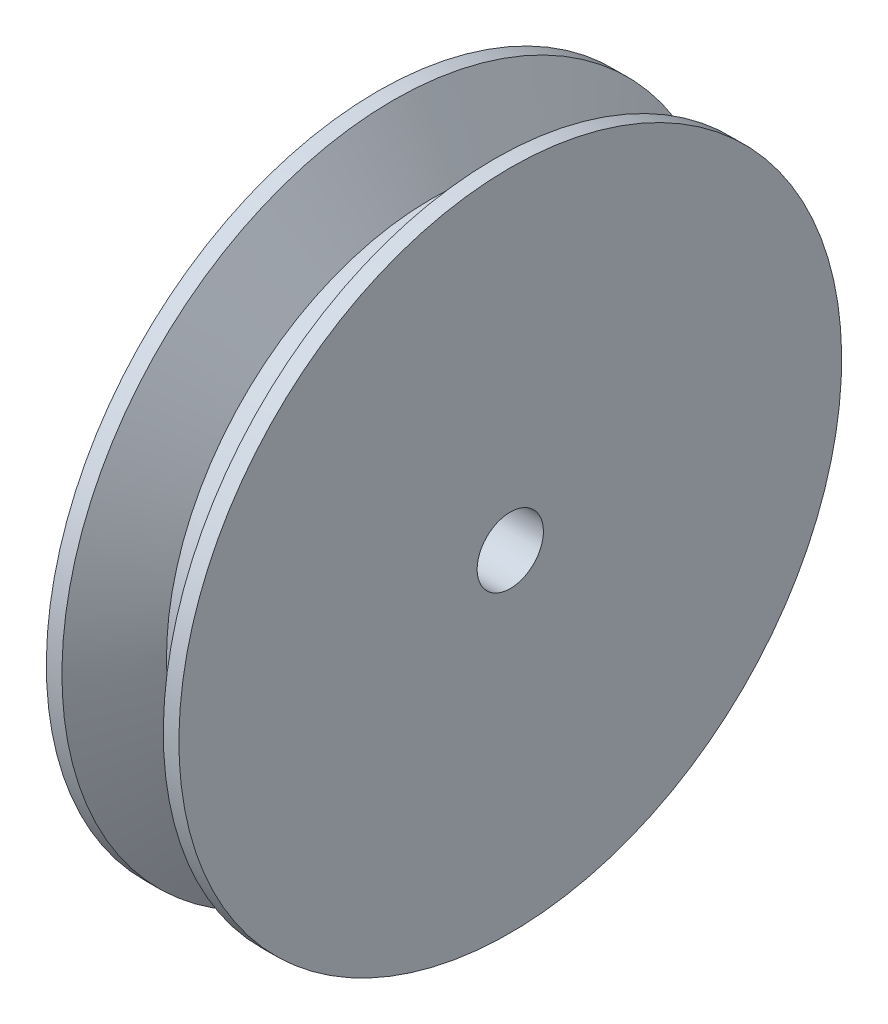
ISO-10303-21;
HEADER;
FILE_DESCRIPTION(('STEP AP214'),'2;1');
FILE_NAME('part.step','',(''),(''),'','','');
FILE_SCHEMA(('AUTOMOTIVE_DESIGN { 1 0 10303 214 1 1 1 1 }'));
ENDSEC;
DATA;
#1=APPLICATION_CONTEXT('core data for automotive mechanical design processes');
#2=APPLICATION_PROTOCOL_DEFINITION('international standard','automotive_design',2000,#1);
#3=PRODUCT_CONTEXT('',#1,'mechanical');
#4=PRODUCT('Part','Part','',(#3));
#5=PRODUCT_RELATED_PRODUCT_CATEGORY('part','',(#4));
#6=PRODUCT_DEFINITION_FORMATION('','',#4);
#7=PRODUCT_DEFINITION_CONTEXT('part definition',#1,'design');
#8=PRODUCT_DEFINITION('design','',#6,#7);
#9=PRODUCT_DEFINITION_SHAPE('','',#8);
#10=(LENGTH_UNIT() NAMED_UNIT(*) SI_UNIT(.MILLI.,.METRE.));
#11=(NAMED_UNIT(*) PLANE_ANGLE_UNIT() SI_UNIT($,.RADIAN.));
#12=(NAMED_UNIT(*) SI_UNIT($,.STERADIAN.) SOLID_ANGLE_UNIT());
#13=UNCERTAINTY_MEASURE_WITH_UNIT(LENGTH_MEASURE(1.E-05),#10,'distance_accuracy_value','');
#14=(GEOMETRIC_REPRESENTATION_CONTEXT(3) GLOBAL_UNCERTAINTY_ASSIGNED_CONTEXT((#13)) GLOBAL_UNIT_ASSIGNED_CONTEXT((#10,
#11,#12)) REPRESENTATION_CONTEXT('',''));
#15=CARTESIAN_POINT('',(0.,0.,0.));
#16=DIRECTION('',(0.,0.,1.));
#17=DIRECTION('',(1.,0.,0.));
#18=AXIS2_PLACEMENT_3D('',#15,#16,#17);
#19=CARTESIAN_POINT('',(4.,0.,0.));
#20=DIRECTION('',(1.,0.,0.));
#21=DIRECTION('',(0.,1.,0.));
#22=AXIS2_PLACEMENT_3D('',#19,#20,#21);
#23=CYLINDRICAL_SURFACE('',#22,20.);
#24=CARTESIAN_POINT('',(-4.00000000000002,0.,0.));
#25=DIRECTION('',(1.,0.,0.));
#26=DIRECTION('',(0.,1.,0.));
#27=AXIS2_PLACEMENT_3D('',#24,#25,#26);
#28=CIRCLE('',#27,20.);
#29=CARTESIAN_POINT('',(-4.,20.,0.));
#30=VERTEX_POINT('',#29);
#31=EDGE_CURVE('E143',#30,#30,#28,.T.);
#32=ORIENTED_EDGE('',*,*,#31,.T.);
#33=EDGE_LOOP('',(#32));
#34=FACE_BOUND('',#33,.T.);
#35=CARTESIAN_POINT('',(-3.05940107675853,0.,0.));
#36=DIRECTION('',(1.,0.,0.));
#37=DIRECTION('',(0.,1.,0.));
#38=AXIS2_PLACEMENT_3D('',#35,#36,#37);
#39=CIRCLE('',#38,20.);
#40=CARTESIAN_POINT('',(-3.05940107675851,20.,0.));
#41=VERTEX_POINT('',#40);
#42=EDGE_CURVE('E167',#41,#41,#39,.T.);
#43=ORIENTED_EDGE('',*,*,#42,.F.);
#44=EDGE_LOOP('',(#43));
#45=FACE_BOUND('',#44,.T.);
#46=ADVANCED_FACE('F41',(#34,#45),#23,.T.);
#47=CARTESIAN_POINT('',(-4.00000000000001,0.,0.));
#48=DIRECTION('',(-1.,0.,0.));
#49=DIRECTION('',(0.,-1.,0.));
#50=AXIS2_PLACEMENT_3D('',#47,#48,#49);
#51=PLANE('',#50);
#52=CARTESIAN_POINT('',(-4.00000000000001,0.,0.));
#53=DIRECTION('',(-1.,0.,0.));
#54=DIRECTION('',(0.,-1.,0.));
#55=AXIS2_PLACEMENT_3D('',#52,#53,#54);
#56=CIRCLE('',#55,5.5);
#57=CARTESIAN_POINT('',(-4.00000000000002,-5.5,0.));
#58=VERTEX_POINT('',#57);
#59=EDGE_CURVE('E10',#58,#58,#56,.F.);
#60=ORIENTED_EDGE('',*,*,#59,.T.);
#61=EDGE_LOOP('',(#60));
#62=FACE_BOUND('',#61,.T.);
#63=ORIENTED_EDGE('',*,*,#31,.F.);
#64=EDGE_LOOP('',(#63));
#65=FACE_BOUND('',#64,.T.);
#66=ADVANCED_FACE('F121',(#62,#65),#51,.T.);
#67=CARTESIAN_POINT('',(3.99999999999999,0.,0.));
#68=DIRECTION('',(1.,0.,0.));
#69=DIRECTION('',(0.,1.,0.));
#70=AXIS2_PLACEMENT_3D('',#67,#68,#69);
#71=PLANE('',#70);
#72=CARTESIAN_POINT('',(4.00000000000002,0.,0.));
#73=DIRECTION('',(-1.,0.,0.));
#74=DIRECTION('',(0.,-1.,0.));
#75=AXIS2_PLACEMENT_3D('',#72,#73,#74);
#76=CIRCLE('',#75,2.);
#77=CARTESIAN_POINT('',(4.00000000000002,-2.,0.));
#78=VERTEX_POINT('',#77);
#79=EDGE_CURVE('E171',#78,#78,#76,.T.);
#80=ORIENTED_EDGE('',*,*,#79,.T.);
#81=EDGE_LOOP('',(#80));
#82=FACE_BOUND('',#81,.T.);
#83=CARTESIAN_POINT('',(3.99999999999998,0.,0.));
#84=DIRECTION('',(1.,0.,0.));
#85=DIRECTION('',(0.,1.,0.));
#86=AXIS2_PLACEMENT_3D('',#83,#84,#85);
#87=CIRCLE('',#86,20.);
#88=CARTESIAN_POINT('',(4.,20.,0.));
#89=VERTEX_POINT('',#88);
#90=EDGE_CURVE('E149',#89,#89,#87,.T.);
#91=ORIENTED_EDGE('',*,*,#90,.T.);
#92=EDGE_LOOP('',(#91));
#93=FACE_BOUND('',#92,.T.);
#94=ADVANCED_FACE('F117',(#82,#93),#71,.T.);
#95=CARTESIAN_POINT('',(4.,0.,0.));
#96=DIRECTION('',(1.,0.,0.));
#97=DIRECTION('',(0.,1.,0.));
#98=AXIS2_PLACEMENT_3D('',#95,#96,#97);
#99=CYLINDRICAL_SURFACE('',#98,20.);
#100=CARTESIAN_POINT('',(3.05940107675849,0.,0.));
#101=DIRECTION('',(1.,0.,0.));
#102=DIRECTION('',(0.,1.,0.));
#103=AXIS2_PLACEMENT_3D('',#100,#101,#102);
#104=CIRCLE('',#103,20.);
#105=CARTESIAN_POINT('',(3.05940107675851,20.,0.));
#106=VERTEX_POINT('',#105);
#107=EDGE_CURVE('E155',#106,#106,#104,.T.);
#108=ORIENTED_EDGE('',*,*,#107,.T.);
#109=EDGE_LOOP('',(#108));
#110=FACE_BOUND('',#109,.T.);
#111=ORIENTED_EDGE('',*,*,#90,.F.);
#112=EDGE_LOOP('',(#111));
#113=FACE_BOUND('',#112,.T.);
#114=ADVANCED_FACE('F113',(#110,#113),#99,.T.);
#115=CARTESIAN_POINT('',(3.05940107675849,0.,0.));
#116=DIRECTION('',(1.,0.,0.));
#117=DIRECTION('',(0.,1.,0.));
#118=AXIS2_PLACEMENT_3D('',#115,#116,#117);
#119=CONICAL_SURFACE('',#118,20.,1.0471975511966);
#120=CARTESIAN_POINT('',(0.749999999999983,0.,0.));
#121=DIRECTION('',(1.,0.,0.));
#122=DIRECTION('',(0.,1.,0.));
#123=AXIS2_PLACEMENT_3D('',#120,#121,#122);
#124=CIRCLE('',#123,16.);
#125=CARTESIAN_POINT('',(0.75,16.,0.));
#126=VERTEX_POINT('',#125);
#127=EDGE_CURVE('E159',#126,#126,#124,.T.);
#128=ORIENTED_EDGE('',*,*,#127,.T.);
#129=EDGE_LOOP('',(#128));
#130=FACE_BOUND('',#129,.T.);
#131=ORIENTED_EDGE('',*,*,#107,.F.);
#132=EDGE_LOOP('',(#131));
#133=FACE_BOUND('',#132,.T.);
#134=ADVANCED_FACE('F109',(#130,#133),#119,.T.);
#135=CARTESIAN_POINT('',(4.,0.,0.));
#136=DIRECTION('',(1.,0.,0.));
#137=DIRECTION('',(0.,1.,0.));
#138=AXIS2_PLACEMENT_3D('',#135,#136,#137);
#139=CYLINDRICAL_SURFACE('',#138,16.);
#140=CARTESIAN_POINT('',(-0.750000000000016,0.,0.));
#141=DIRECTION('',(1.,0.,0.));
#142=DIRECTION('',(0.,1.,0.));
#143=AXIS2_PLACEMENT_3D('',#140,#141,#142);
#144=CIRCLE('',#143,16.);
#145=CARTESIAN_POINT('',(-0.75,16.,0.));
#146=VERTEX_POINT('',#145);
#147=EDGE_CURVE('E163',#146,#146,#144,.T.);
#148=ORIENTED_EDGE('',*,*,#147,.T.);
#149=EDGE_LOOP('',(#148));
#150=FACE_BOUND('',#149,.T.);
#151=ORIENTED_EDGE('',*,*,#127,.F.);
#152=EDGE_LOOP('',(#151));
#153=FACE_BOUND('',#152,.T.);
#154=ADVANCED_FACE('F105',(#150,#153),#139,.T.);
#155=CARTESIAN_POINT('',(-0.750000000000016,0.,0.));
#156=DIRECTION('',(-1.,0.,0.));
#157=DIRECTION('',(0.,-1.,0.));
#158=AXIS2_PLACEMENT_3D('',#155,#156,#157);
#159=CONICAL_SURFACE('',#158,16.,1.0471975511966);
#160=ORIENTED_EDGE('',*,*,#42,.T.);
#161=EDGE_LOOP('',(#160));
#162=FACE_BOUND('',#161,.T.);
#163=ORIENTED_EDGE('',*,*,#147,.F.);
#164=EDGE_LOOP('',(#163));
#165=FACE_BOUND('',#164,.T.);
#166=ADVANCED_FACE('F100',(#162,#165),#159,.T.);
#167=CARTESIAN_POINT('',(-10.,0.,0.));
#168=DIRECTION('',(1.,0.,0.));
#169=DIRECTION('',(0.,1.,0.));
#170=AXIS2_PLACEMENT_3D('',#167,#168,#169);
#171=CYLINDRICAL_SURFACE('',#170,5.);
#172=CARTESIAN_POINT('',(-6.,0.,-5.));
#173=CARTESIAN_POINT('',(-6.00000204449835,0.0555769067926331,-4.99999897580871));
#174=CARTESIAN_POINT('',(-6.00464884296765,0.111179660201522,-4.99906385178231));
#175=CARTESIAN_POINT('',(-6.02309850011525,0.220813507689019,-4.99542365623231));
#176=CARTESIAN_POINT('',(-6.03690863280151,0.274843317541356,-4.99271717860186));
#177=CARTESIAN_POINT('',(-6.07324127362079,0.379730305263313,-4.98583649278287));
#178=CARTESIAN_POINT('',(-6.09575543684469,0.430590467933134,-4.98166369076718));
#179=CARTESIAN_POINT('',(-6.1488322475113,0.527807988864225,-4.97230398035314));
#180=CARTESIAN_POINT('',(-6.17939441560721,0.574165615075811,-4.96711713235707));
#181=CARTESIAN_POINT('',(-6.24813849429143,0.661693477314865,-4.9562216532997));
#182=CARTESIAN_POINT('',(-6.2864083553912,0.702793951158524,-4.95050745504347));
#183=CARTESIAN_POINT('',(-6.3692924163917,0.778036756608028,-4.93924180452588));
#184=CARTESIAN_POINT('',(-6.41390711133512,0.812178544770424,-4.93369036500424));
#185=CARTESIAN_POINT('',(-6.50871619301188,0.87283175334762,-4.92332441812615));
#186=CARTESIAN_POINT('',(-6.55895764379636,0.899270938865866,-4.91851707364946));
#187=CARTESIAN_POINT('',(-6.66328181900408,0.943305666580308,-4.91026268058418));
#188=CARTESIAN_POINT('',(-6.71736416334635,0.960902082437237,-4.90681549761962));
#189=CARTESIAN_POINT('',(-6.82708436390792,0.986525299884827,-4.90172805252205));
#190=CARTESIAN_POINT('',(-6.88269254414223,0.994674497958777,-4.90006470107188));
#191=CARTESIAN_POINT('',(-6.99450982136434,1.00155212772612,-4.89866375060627));
#192=CARTESIAN_POINT('',(-7.05071885632015,1.0002815227135,-4.89892595467841));
#193=CARTESIAN_POINT('',(-7.161246788021,0.988454573101819,-4.90132551148185));
#194=CARTESIAN_POINT('',(-7.21558140562732,0.978038540243905,-4.90343452858764));
#195=CARTESIAN_POINT('',(-7.321716076663,0.94843788462305,-4.90924546160001));
#196=CARTESIAN_POINT('',(-7.37351600891901,0.92925284310068,-4.91294745357779));
#197=CARTESIAN_POINT('',(-7.4735152617036,0.882524783674719,-4.92155618500408));
#198=CARTESIAN_POINT('',(-7.52168787956917,0.854926151232114,-4.92647089813705));
#199=CARTESIAN_POINT('',(-7.61277084997282,0.792193574572679,-4.93694618773062));
#200=CARTESIAN_POINT('',(-7.65568059685116,0.757058764356829,-4.94250683838366));
#201=CARTESIAN_POINT('',(-7.73582940245694,0.679499934560584,-4.95377021241462));
#202=CARTESIAN_POINT('',(-7.77295256785913,0.636956161212445,-4.95947369210905));
#203=CARTESIAN_POINT('',(-7.83955384630122,0.54618502406201,-4.97028848714409));
#204=CARTESIAN_POINT('',(-7.86903186129358,0.497957587379389,-4.97539979488974));
#205=CARTESIAN_POINT('',(-7.91952750922597,0.397059386878921,-4.98446690160887));
#206=CARTESIAN_POINT('',(-7.94053189364454,0.3443818195853,-4.98842088848272));
#207=CARTESIAN_POINT('',(-7.97336047403857,0.236148976448665,-4.99471408987858));
#208=CARTESIAN_POINT('',(-7.98518578207363,0.18059405007245,-4.99705350000531));
#209=CARTESIAN_POINT('',(-7.99915645379428,0.0691794056271505,-4.99982671866868));
#210=CARTESIAN_POINT('',(-8.00146041954027,0.0133403283255763,-5.0002917465247));
#211=CARTESIAN_POINT('',(-7.99675014105782,-0.0979249341927139,-4.99935051930103));
#212=CARTESIAN_POINT('',(-7.9897364206474,-0.153351142443793,-4.99794436941446));
#213=CARTESIAN_POINT('',(-7.96672162645604,-0.261705659946541,-4.99343832008018));
#214=CARTESIAN_POINT('',(-7.9508019315021,-0.314651948339903,-4.99035376404206));
#215=CARTESIAN_POINT('',(-7.91051601734419,-0.417123627499667,-4.98283552061033));
#216=CARTESIAN_POINT('',(-7.88614916532317,-0.466648761637539,-4.97840173214227));
#217=CARTESIAN_POINT('',(-7.82931750934869,-0.561541173686217,-4.96859911533294));
#218=CARTESIAN_POINT('',(-7.79675721896106,-0.606850126752188,-4.96321950437052));
#219=CARTESIAN_POINT('',(-7.72459080879272,-0.691418019119207,-4.95214734829882));
#220=CARTESIAN_POINT('',(-7.68498393360013,-0.730676308930762,-4.94645476968388));
#221=CARTESIAN_POINT('',(-7.59912664810888,-0.802640590774176,-4.93529303556965));
#222=CARTESIAN_POINT('',(-7.55278425577866,-0.835237702448655,-4.92982860233304));
#223=CARTESIAN_POINT('',(-7.45518863864332,-0.892185420051205,-4.91984191796194));
#224=CARTESIAN_POINT('',(-7.40393561042645,-0.916536355922903,-4.91531962913342));
#225=CARTESIAN_POINT('',(-7.29823175385045,-0.95615184158196,-4.90776740584383));
#226=CARTESIAN_POINT('',(-7.24379915878968,-0.97146349979105,-4.90472974872186));
#227=CARTESIAN_POINT('',(-7.1330665465091,-0.992708651627196,-4.90047436792025));
#228=CARTESIAN_POINT('',(-7.07676677379065,-0.998643368225112,-4.89925640691111));
#229=CARTESIAN_POINT('',(-6.96499113545568,-1.00092091086747,-4.89879149631379));
#230=CARTESIAN_POINT('',(-6.90951885107299,-0.997435788070896,-4.89950919189301));
#231=CARTESIAN_POINT('',(-6.79996835009498,-0.981352304100061,-4.90275573484614));
#232=CARTESIAN_POINT('',(-6.7458901223052,-0.968754016129298,-4.90528456767169));
#233=CARTESIAN_POINT('',(-6.64077228875946,-0.934878568498954,-4.91185264219158));
#234=CARTESIAN_POINT('',(-6.58972563949759,-0.913622506717345,-4.9158882101883));
#235=CARTESIAN_POINT('',(-6.49189627926556,-0.863054644601605,-4.9250171497417));
#236=CARTESIAN_POINT('',(-6.44511392627486,-0.833742168774883,-4.93011060998894));
#237=CARTESIAN_POINT('',(-6.35628442784969,-0.767305914786415,-4.94088960523225));
#238=CARTESIAN_POINT('',(-6.31433123473241,-0.730057887235181,-4.94658372909699));
#239=CARTESIAN_POINT('',(-6.23721379447083,-0.649064369013142,-4.95786081871954));
#240=CARTESIAN_POINT('',(-6.20205110968273,-0.605317387153336,-4.96344375863184));
#241=CARTESIAN_POINT('',(-6.13916535605355,-0.512017629088248,-4.97393832387971));
#242=CARTESIAN_POINT('',(-6.11152399671998,-0.462408884429836,-4.97884231219246));
#243=CARTESIAN_POINT('',(-6.06501387740341,-0.359166360940734,-4.98735125085));
#244=CARTESIAN_POINT('',(-6.04613721046751,-0.305536260863128,-4.99095737138616));
#245=CARTESIAN_POINT('',(-6.02134805195529,-0.20982148892378,-4.99576372595371));
#246=CARTESIAN_POINT('',(-6.01335680629224,-0.168281664013785,-4.99734303158452));
#247=CARTESIAN_POINT('',(-6.00268208764164,-0.0844995252100673,-4.99946154139893));
#248=CARTESIAN_POINT('',(-5.99999844549023,-0.0422572337486192,-5.00000077873155));
#249=CARTESIAN_POINT('',(-6.,0.,-5.));
#250=B_SPLINE_CURVE_WITH_KNOTS('',3,(#172,#173,#174,#175,#176,#177,#178,#179,#180,#181,#182,
#183,#184,#185,#186,#187,#188,#189,#190,#191,#192,#193,#194,#195,#196,#197,#198,#199,#200,#201,
#202,#203,#204,#205,#206,#207,#208,#209,#210,#211,#212,#213,#214,#215,#216,#217,#218,#219,#220,
#221,#222,#223,#224,#225,#226,#227,#228,#229,#230,#231,#232,#233,#234,#235,#236,#237,#238,#239,
#240,#241,#242,#243,#244,#245,#246,#247,#248,#249),.UNSPECIFIED.,.T.,.F.,(4,2,2,2,2,2,2,2,2,2,2,
2,2,2,2,2,2,2,2,2,2,2,2,2,2,2,2,2,2,2,2,2,2,2,2,2,2,2,4),(0.,0.166576130661258,
0.333284650691323,0.499833735250341,0.666372902230862,0.834932670112186,1.00350559674737,
1.17361195005923,1.34370149365197,1.51156185103587,1.67940504281225,1.84471727006278,
2.0100373925373,2.17647490203593,2.3429315474967,2.51238252491351,2.6818356753982,
2.85155274854024,3.02124925698036,3.18810735676265,3.35495607657867,3.52030453950723,
3.68566539216022,3.85305066033358,4.0204538834593,4.19040628579226,4.36035188723466,
4.52940381032723,4.69843368330414,4.86439722567701,5.03035943492608,5.1959196125311,
5.36149367581866,5.52988076239143,5.6983065453293,5.86849496675637,6.03852955517518,
6.16518775289894,6.29184191370996),.UNSPECIFIED.);
#251=CARTESIAN_POINT('',(-6.,0.,-5.));
#252=VERTEX_POINT('',#251);
#253=EDGE_CURVE('E90',#252,#252,#250,.T.);
#254=ORIENTED_EDGE('',*,*,#253,.T.);
#255=EDGE_LOOP('',(#254));
#256=FACE_BOUND('',#255,.T.);
#257=CARTESIAN_POINT('',(-6.,0.,5.));
#258=CARTESIAN_POINT('',(-6.00000204449835,-0.0555769067926332,4.99999897580871));
#259=CARTESIAN_POINT('',(-6.00464884296765,-0.111179660201522,4.99906385178231));
#260=CARTESIAN_POINT('',(-6.02309850011525,-0.220813507689019,4.99542365623231));
#261=CARTESIAN_POINT('',(-6.03690863280151,-0.274843317541356,4.99271717860186));
#262=CARTESIAN_POINT('',(-6.07324127362079,-0.379730305263313,4.98583649278287));
#263=CARTESIAN_POINT('',(-6.09575543684469,-0.430590467933134,4.98166369076718));
#264=CARTESIAN_POINT('',(-6.1488322475113,-0.527807988864225,4.97230398035314));
#265=CARTESIAN_POINT('',(-6.17939441560721,-0.574165615075812,4.96711713235707));
#266=CARTESIAN_POINT('',(-6.24813849429144,-0.661693477314865,4.9562216532997));
#267=CARTESIAN_POINT('',(-6.2864083553912,-0.702793951158524,4.95050745504347));
#268=CARTESIAN_POINT('',(-6.3692924163917,-0.778036756608028,4.93924180452588));
#269=CARTESIAN_POINT('',(-6.41390711133512,-0.812178544770424,4.93369036500424));
#270=CARTESIAN_POINT('',(-6.50871619301188,-0.87283175334762,4.92332441812615));
#271=CARTESIAN_POINT('',(-6.55895764379636,-0.899270938865866,4.91851707364946));
#272=CARTESIAN_POINT('',(-6.66328181900408,-0.943305666580308,4.91026268058418));
#273=CARTESIAN_POINT('',(-6.71736416334635,-0.960902082437238,4.90681549761962));
#274=CARTESIAN_POINT('',(-6.82708436390792,-0.986525299884827,4.90172805252204));
#275=CARTESIAN_POINT('',(-6.88269254414223,-0.994674497958777,4.90006470107188));
#276=CARTESIAN_POINT('',(-6.99450982136435,-1.00155212772612,4.89866375060627));
#277=CARTESIAN_POINT('',(-7.05071885632015,-1.0002815227135,4.89892595467841));
#278=CARTESIAN_POINT('',(-7.16124678802101,-0.988454573101819,4.90132551148184));
#279=CARTESIAN_POINT('',(-7.21558140562732,-0.978038540243905,4.90343452858763));
#280=CARTESIAN_POINT('',(-7.321716076663,-0.94843788462305,4.90924546160001));
#281=CARTESIAN_POINT('',(-7.37351600891901,-0.92925284310068,4.91294745357779));
#282=CARTESIAN_POINT('',(-7.4735152617036,-0.882524783674719,4.92155618500408));
#283=CARTESIAN_POINT('',(-7.52168787956917,-0.854926151232114,4.92647089813704));
#284=CARTESIAN_POINT('',(-7.61277084997282,-0.792193574572679,4.93694618773062));
#285=CARTESIAN_POINT('',(-7.65568059685116,-0.757058764356829,4.94250683838366));
#286=CARTESIAN_POINT('',(-7.73582940245694,-0.679499934560584,4.95377021241462));
#287=CARTESIAN_POINT('',(-7.77295256785913,-0.636956161212445,4.95947369210905));
#288=CARTESIAN_POINT('',(-7.83955384630122,-0.54618502406201,4.97028848714408));
#289=CARTESIAN_POINT('',(-7.86903186129358,-0.497957587379389,4.97539979488974));
#290=CARTESIAN_POINT('',(-7.91952750922597,-0.39705938687892,4.98446690160887));
#291=CARTESIAN_POINT('',(-7.94053189364454,-0.3443818195853,4.98842088848272));
#292=CARTESIAN_POINT('',(-7.97336047403857,-0.236148976448665,4.99471408987858));
#293=CARTESIAN_POINT('',(-7.98518578207363,-0.180594050072449,4.99705350000531));
#294=CARTESIAN_POINT('',(-7.99915645379428,-0.0691794056271501,4.99982671866868));
#295=CARTESIAN_POINT('',(-8.00146041954027,-0.0133403283255758,5.0002917465247));
#296=CARTESIAN_POINT('',(-7.99675014105782,0.0979249341927144,4.99935051930103));
#297=CARTESIAN_POINT('',(-7.9897364206474,0.153351142443793,4.99794436941446));
#298=CARTESIAN_POINT('',(-7.96672162645604,0.261705659946541,4.99343832008018));
#299=CARTESIAN_POINT('',(-7.9508019315021,0.314651948339904,4.99035376404206));
#300=CARTESIAN_POINT('',(-7.91051601734419,0.417123627499667,4.98283552061033));
#301=CARTESIAN_POINT('',(-7.88614916532317,0.46664876163754,4.97840173214227));
#302=CARTESIAN_POINT('',(-7.82931750934869,0.561541173686217,4.96859911533294));
#303=CARTESIAN_POINT('',(-7.79675721896106,0.606850126752188,4.96321950437052));
#304=CARTESIAN_POINT('',(-7.72459080879272,0.691418019119207,4.95214734829883));
#305=CARTESIAN_POINT('',(-7.68498393360013,0.730676308930762,4.94645476968388));
#306=CARTESIAN_POINT('',(-7.59912664810888,0.802640590774175,4.93529303556965));
#307=CARTESIAN_POINT('',(-7.55278425577866,0.835237702448654,4.92982860233304));
#308=CARTESIAN_POINT('',(-7.45518863864332,0.892185420051205,4.91984191796194));
#309=CARTESIAN_POINT('',(-7.40393561042645,0.916536355922902,4.91531962913343));
#310=CARTESIAN_POINT('',(-7.29823175385045,0.95615184158196,4.90776740584383));
#311=CARTESIAN_POINT('',(-7.24379915878968,0.97146349979105,4.90472974872187));
#312=CARTESIAN_POINT('',(-7.1330665465091,0.992708651627196,4.90047436792025));
#313=CARTESIAN_POINT('',(-7.07676677379065,0.998643368225112,4.89925640691112));
#314=CARTESIAN_POINT('',(-6.96499113545568,1.00092091086747,4.89879149631379));
#315=CARTESIAN_POINT('',(-6.90951885107299,0.997435788070896,4.89950919189301));
#316=CARTESIAN_POINT('',(-6.79996835009497,0.98135230410006,4.90275573484614));
#317=CARTESIAN_POINT('',(-6.7458901223052,0.968754016129298,4.90528456767169));
#318=CARTESIAN_POINT('',(-6.64077228875946,0.934878568498954,4.91185264219159));
#319=CARTESIAN_POINT('',(-6.58972563949759,0.913622506717344,4.91588821018831));
#320=CARTESIAN_POINT('',(-6.49189627926556,0.863054644601604,4.9250171497417));
#321=CARTESIAN_POINT('',(-6.44511392627486,0.833742168774882,4.93011060998894));
#322=CARTESIAN_POINT('',(-6.35628442784969,0.767305914786414,4.94088960523225));
#323=CARTESIAN_POINT('',(-6.31433123473241,0.73005788723518,4.946583729097));
#324=CARTESIAN_POINT('',(-6.23721379447083,0.64906436901314,4.95786081871955));
#325=CARTESIAN_POINT('',(-6.20205110968273,0.605317387153334,4.96344375863185));
#326=CARTESIAN_POINT('',(-6.13916535605355,0.512017629088246,4.97393832387972));
#327=CARTESIAN_POINT('',(-6.11152399671998,0.462408884429834,4.97884231219246));
#328=CARTESIAN_POINT('',(-6.06501387740341,0.359166360940732,4.98735125085));
#329=CARTESIAN_POINT('',(-6.04613721046751,0.305536260863125,4.99095737138616));
#330=CARTESIAN_POINT('',(-6.02134805195529,0.209821488923778,4.99576372595371));
#331=CARTESIAN_POINT('',(-6.01335680629224,0.168281664013784,4.99734303158452));
#332=CARTESIAN_POINT('',(-6.00268208764164,0.0844995252100663,4.99946154139893));
#333=CARTESIAN_POINT('',(-5.99999844549023,0.0422572337486187,5.00000077873155));
#334=CARTESIAN_POINT('',(-6.,0.,5.));
#335=B_SPLINE_CURVE_WITH_KNOTS('',3,(#257,#258,#259,#260,#261,#262,#263,#264,#265,#266,#267,
#268,#269,#270,#271,#272,#273,#274,#275,#276,#277,#278,#279,#280,#281,#282,#283,#284,#285,#286,
#287,#288,#289,#290,#291,#292,#293,#294,#295,#296,#297,#298,#299,#300,#301,#302,#303,#304,#305,
#306,#307,#308,#309,#310,#311,#312,#313,#314,#315,#316,#317,#318,#319,#320,#321,#322,#323,#324,
#325,#326,#327,#328,#329,#330,#331,#332,#333,#334),.UNSPECIFIED.,.T.,.F.,(4,2,2,2,2,2,2,2,2,2,2,
2,2,2,2,2,2,2,2,2,2,2,2,2,2,2,2,2,2,2,2,2,2,2,2,2,2,2,4),(0.,0.166576130661258,
0.333284650691323,0.499833735250341,0.666372902230863,0.834932670112186,1.00350559674737,
1.17361195005923,1.34370149365198,1.51156185103587,1.67940504281225,1.84471727006278,
2.0100373925373,2.17647490203593,2.3429315474967,2.51238252491351,2.6818356753982,
2.85155274854024,3.02124925698036,3.18810735676265,3.35495607657868,3.52030453950723,
3.68566539216022,3.85305066033358,4.0204538834593,4.19040628579226,4.36035188723466,
4.52940381032723,4.69843368330415,4.86439722567701,5.03035943492608,5.1959196125311,
5.36149367581866,5.52988076239143,5.6983065453293,5.86849496675637,6.03852955517518,
6.16518775289894,6.29184191370996),.UNSPECIFIED.);
#336=CARTESIAN_POINT('',(-6.,0.,5.));
#337=VERTEX_POINT('',#336);
#338=EDGE_CURVE('E83',#337,#337,#335,.T.);
#339=ORIENTED_EDGE('',*,*,#338,.T.);
#340=EDGE_LOOP('',(#339));
#341=FACE_BOUND('',#340,.T.);
#342=CARTESIAN_POINT('',(-9.50000000000001,0.,0.));
#343=DIRECTION('',(-1.,0.,0.));
#344=DIRECTION('',(0.,-1.,0.));
#345=AXIS2_PLACEMENT_3D('',#342,#343,#344);
#346=CIRCLE('',#345,5.);
#347=CARTESIAN_POINT('',(-9.50000000000002,-4.99999999999999,0.));
#348=VERTEX_POINT('',#347);
#349=EDGE_CURVE('E55',#348,#348,#346,.F.);
#350=ORIENTED_EDGE('',*,*,#349,.T.);
#351=EDGE_LOOP('',(#350));
#352=FACE_BOUND('',#351,.T.);
#353=CARTESIAN_POINT('',(-4.50000000000001,0.,0.));
#354=DIRECTION('',(-1.,0.,0.));
#355=DIRECTION('',(0.,-1.,0.));
#356=AXIS2_PLACEMENT_3D('',#353,#354,#355);
#357=CIRCLE('',#356,5.);
#358=CARTESIAN_POINT('',(-4.50000000000002,-5.,0.));
#359=VERTEX_POINT('',#358);
#360=EDGE_CURVE('E61',#359,#359,#357,.T.);
#361=ORIENTED_EDGE('',*,*,#360,.T.);
#362=EDGE_LOOP('',(#361));
#363=FACE_BOUND('',#362,.T.);
#364=ADVANCED_FACE('F95',(#256,#341,#352,#363),#171,.T.);
#365=CARTESIAN_POINT('',(-10.,0.,0.));
#366=DIRECTION('',(-1.,0.,0.));
#367=DIRECTION('',(0.,-1.,0.));
#368=AXIS2_PLACEMENT_3D('',#365,#366,#367);
#369=PLANE('',#368);
#370=CARTESIAN_POINT('',(-10.,0.,0.));
#371=DIRECTION('',(-1.,0.,0.));
#372=DIRECTION('',(0.,-1.,0.));
#373=AXIS2_PLACEMENT_3D('',#370,#371,#372);
#374=CIRCLE('',#373,4.5);
#375=CARTESIAN_POINT('',(-10.,-4.49999999999999,0.));
#376=VERTEX_POINT('',#375);
#377=EDGE_CURVE('E140',#376,#376,#374,.T.);
#378=ORIENTED_EDGE('',*,*,#377,.T.);
#379=EDGE_LOOP('',(#378));
#380=FACE_BOUND('',#379,.T.);
#381=CARTESIAN_POINT('',(-10.,0.,0.));
#382=DIRECTION('',(-1.,0.,0.));
#383=DIRECTION('',(0.,-1.,0.));
#384=AXIS2_PLACEMENT_3D('',#381,#382,#383);
#385=CIRCLE('',#384,2.);
#386=CARTESIAN_POINT('',(-10.,-1.99999999999999,0.));
#387=VERTEX_POINT('',#386);
#388=EDGE_CURVE('E172',#387,#387,#385,.T.);
#389=ORIENTED_EDGE('',*,*,#388,.F.);
#390=EDGE_LOOP('',(#389));
#391=FACE_BOUND('',#390,.T.);
#392=ADVANCED_FACE('F99',(#380,#391),#369,.T.);
#393=CARTESIAN_POINT('',(4.00000000000002,0.,0.));
#394=DIRECTION('',(-1.,0.,0.));
#395=DIRECTION('',(0.,-1.,0.));
#396=AXIS2_PLACEMENT_3D('',#393,#394,#395);
#397=CYLINDRICAL_SURFACE('',#396,2.);
#398=CARTESIAN_POINT('',(-6.,0.,-2.));
#399=CARTESIAN_POINT('',(-6.0000033023195,-0.0525719629529866,-1.99999713404151));
#400=CARTESIAN_POINT('',(-6.00417007312168,-0.105206599698033,-1.99790491019518));
#401=CARTESIAN_POINT('',(-6.02065288034092,-0.208920235268425,-1.98974156037396));
#402=CARTESIAN_POINT('',(-6.03298439299765,-0.259996086713504,-1.98366287828983));
#403=CARTESIAN_POINT('',(-6.0651938086168,-0.358933544880575,-1.96816279403311));
#404=CARTESIAN_POINT('',(-6.08504238424801,-0.40680680293918,-1.9587543917752));
#405=CARTESIAN_POINT('',(-6.13157062136494,-0.498472616806565,-1.93745776515778));
#406=CARTESIAN_POINT('',(-6.15824974424885,-0.54226549399005,-1.9255697363353));
#407=CARTESIAN_POINT('',(-6.2195172494853,-0.627507817761919,-1.89956258258057));
#408=CARTESIAN_POINT('',(-6.25448647923964,-0.668655211122112,-1.88535199127536));
#409=CARTESIAN_POINT('',(-6.33052147924704,-0.744779444866977,-1.85659970246744));
#410=CARTESIAN_POINT('',(-6.37159185177244,-0.779751583106767,-1.84205776209035));
#411=CARTESIAN_POINT('',(-6.46248334952338,-0.845252000450279,-1.81298951197347));
#412=CARTESIAN_POINT('',(-6.51273609834591,-0.875225335551638,-1.79855186970131));
#413=CARTESIAN_POINT('',(-6.61836733598622,-0.926168226890696,-1.7728597877232));
#414=CARTESIAN_POINT('',(-6.67374212872275,-0.947144214966334,-1.76160307606989));
#415=CARTESIAN_POINT('',(-6.78466510542192,-0.978132442188589,-1.74457867037808));
#416=CARTESIAN_POINT('',(-6.8400044520674,-0.988725857080441,-1.73852271583713));
#417=CARTESIAN_POINT('',(-6.95197883777948,-1.00042699330885,-1.73181889948527));
#418=CARTESIAN_POINT('',(-7.00861254087116,-1.00154408837307,-1.73116569343288));
#419=CARTESIAN_POINT('',(-7.11428602431537,-0.994687287172294,-1.73510930257248));
#420=CARTESIAN_POINT('',(-7.16342403122305,-0.987784559536821,-1.73908763662013));
#421=CARTESIAN_POINT('',(-7.25972190937304,-0.966939849056932,-1.7507622873385));
#422=CARTESIAN_POINT('',(-7.30688114530532,-0.952995623897651,-1.75845978831776));
#423=CARTESIAN_POINT('',(-7.39922913256566,-0.918209780386003,-1.77687476412741));
#424=CARTESIAN_POINT('',(-7.44434639878579,-0.897215067115994,-1.78765840663998));
#425=CARTESIAN_POINT('',(-7.53063429259001,-0.849041687668002,-1.81103404281403));
#426=CARTESIAN_POINT('',(-7.57180313560009,-0.821860243812467,-1.8236268478019));
#427=CARTESIAN_POINT('',(-7.65452125274323,-0.758066054912789,-1.85113157903285));
#428=CARTESIAN_POINT('',(-7.69545687357616,-0.720694458369282,-1.86613510236746));
#429=CARTESIAN_POINT('',(-7.7707354185909,-0.639555578741374,-1.89547623300407));
#430=CARTESIAN_POINT('',(-7.80507519203388,-0.595785256574287,-1.90981351958801));
#431=CARTESIAN_POINT('',(-7.86768566102973,-0.50051650583185,-1.93701987282964));
#432=CARTESIAN_POINT('',(-7.89560047244574,-0.44875359159941,-1.94978984162007));
#433=CARTESIAN_POINT('',(-7.94209702904301,-0.340466215488798,-1.97157881121242));
#434=CARTESIAN_POINT('',(-7.96068618501517,-0.283945576265278,-1.98060078943552));
#435=CARTESIAN_POINT('',(-7.98647540371668,-0.172766491660703,-1.99324333741436));
#436=CARTESIAN_POINT('',(-7.99449123574678,-0.118341530548325,-1.99724938301312));
#437=CARTESIAN_POINT('',(-8.00146473113449,-0.00877959994935434,-2.00073013459102));
#438=CARTESIAN_POINT('',(-8.00042668563948,0.046357019869901,-2.00020698721312));
#439=CARTESIAN_POINT('',(-7.98979331158125,0.151232971985993,-1.99491192253441));
#440=CARTESIAN_POINT('',(-7.98086746726997,0.201059408049954,-1.9904724568819));
#441=CARTESIAN_POINT('',(-7.95576192810491,0.298406892301917,-1.97822171314819));
#442=CARTESIAN_POINT('',(-7.93958143354664,0.345927685690996,-1.97041006334333));
#443=CARTESIAN_POINT('',(-7.90000153356683,0.438888608449666,-1.9518425141367));
#444=CARTESIAN_POINT('',(-7.87640894988319,0.484230397006154,-1.94100881769939));
#445=CARTESIAN_POINT('',(-7.82289246435396,0.570461361698922,-1.91743974317109));
#446=CARTESIAN_POINT('',(-7.79296586540657,0.611348629775282,-1.90470355565785));
#447=CARTESIAN_POINT('',(-7.72423957466713,0.691767689290653,-1.87708221337465));
#448=CARTESIAN_POINT('',(-7.68485713154644,0.730772077824639,-1.86210884848442));
#449=CARTESIAN_POINT('',(-7.6000748487307,0.80185632111324,-1.83262391603875));
#450=CARTESIAN_POINT('',(-7.55467088118363,0.833931385690841,-1.81811267381527));
#451=CARTESIAN_POINT('',(-7.45635634579969,0.891707914497695,-1.79051192226068));
#452=CARTESIAN_POINT('',(-7.40318873379141,0.917025495878637,-1.77752529663472));
#453=CARTESIAN_POINT('',(-7.29248993230748,0.958082826013803,-1.75574072368127));
#454=CARTESIAN_POINT('',(-7.23496447349881,0.973834915887569,-1.74693738240618));
#455=CARTESIAN_POINT('',(-7.12308977713855,0.993861687449679,-1.73561501008667));
#456=CARTESIAN_POINT('',(-7.06896574657096,0.999092996400865,-1.73257383460492));
#457=CARTESIAN_POINT('',(-6.96055293282927,1.00068915438079,-1.73165354646175));
#458=CARTESIAN_POINT('',(-6.90626423126057,0.997057846624399,-1.73377219627553));
#459=CARTESIAN_POINT('',(-6.80451649846799,0.981926125592263,-1.74237862050025));
#460=CARTESIAN_POINT('',(-6.7568995298556,0.9712083143428,-1.74843094482394));
#461=CARTESIAN_POINT('',(-6.6641918805753,0.943175358224645,-1.76371016187918));
#462=CARTESIAN_POINT('',(-6.61910201790803,0.92585809115981,-1.77293807569676));
#463=CARTESIAN_POINT('',(-6.5293751490134,0.883815745300682,-1.79428530364528));
#464=CARTESIAN_POINT('',(-6.4849720981703,0.858671137816458,-1.80655722396191));
#465=CARTESIAN_POINT('',(-6.40072546381941,0.802150971636634,-1.83235331634591));
#466=CARTESIAN_POINT('',(-6.36088426948151,0.770772171238647,-1.84587813794522));
#467=CARTESIAN_POINT('',(-6.28185801764238,0.69820332666464,-1.87462323159313));
#468=CARTESIAN_POINT('',(-6.24334089763808,0.65628442301017,-1.88984983311469));
#469=CARTESIAN_POINT('',(-6.17373701657637,0.566154806220278,-1.91877752255088));
#470=CARTESIAN_POINT('',(-6.14265426057371,0.517940723256784,-1.9324777860804));
#471=CARTESIAN_POINT('',(-6.0887636372378,0.415931596819946,-1.95698009585103));
#472=CARTESIAN_POINT('',(-6.06601583058857,0.362099503934613,-1.96776096562909));
#473=CARTESIAN_POINT('',(-6.03019183208105,0.25074210129419,-1.98501341363466));
#474=CARTESIAN_POINT('',(-6.01708815317042,0.193227799623165,-1.99149723372932));
#475=CARTESIAN_POINT('',(-6.00610258892415,0.112601946483383,-1.99695461909663));
#476=CARTESIAN_POINT('',(-6.00381735913638,0.0901618794394978,-1.99809365339202));
#477=CARTESIAN_POINT('',(-6.0007653344832,0.0451517318071571,-1.99961696977865));
#478=CARTESIAN_POINT('',(-5.9999985815288,0.0225816476473811,-2.00000123103763));
#479=CARTESIAN_POINT('',(-6.,0.,-2.));
#480=B_SPLINE_CURVE_WITH_KNOTS('',3,(#398,#399,#400,#401,#402,#403,#404,#405,#406,#407,#408,
#409,#410,#411,#412,#413,#414,#415,#416,#417,#418,#419,#420,#421,#422,#423,#424,#425,#426,#427,
#428,#429,#430,#431,#432,#433,#434,#435,#436,#437,#438,#439,#440,#441,#442,#443,#444,#445,#446,
#447,#448,#449,#450,#451,#452,#453,#454,#455,#456,#457,#458,#459,#460,#461,#462,#463,#464,#465,
#466,#467,#468,#469,#470,#471,#472,#473,#474,#475,#476,#477,#478,#479),.UNSPECIFIED.,.T.,.F.,(4,
2,2,2,2,2,2,2,2,2,2,2,2,2,2,2,2,2,2,2,2,2,2,2,2,2,2,2,2,2,2,2,2,2,2,2,2,2,2,2,4),(0.,
0.157624257420293,0.315548149709198,0.472862155492299,0.630163760581568,0.79698175871809,
0.963926237654037,1.14381726430753,1.32357947898281,1.4925801214023,1.66141357329021,
1.81005712409321,1.95874803925679,2.11090240168487,2.26312521260222,2.43464941333878,
2.60625534598686,2.7858302221444,2.96526216912279,3.12983290471346,3.29432564511476,
3.44606906506122,3.59782921630932,3.75392856027899,3.91009450748339,4.08159610644419,
4.25321588615432,4.43314682159674,4.61284511940777,4.77529307498373,4.93767059860005,
5.08457930244183,5.23153528783678,5.38836456775614,5.54527561138958,5.72125242752498,
5.89732383376572,6.07464013662925,6.2514490862493,6.31915280137698,6.38685838514847),.UNSPECIFIED.);
#481=CARTESIAN_POINT('',(-6.,0.,-2.));
#482=VERTEX_POINT('',#481);
#483=EDGE_CURVE('E45',#482,#482,#480,.T.);
#484=ORIENTED_EDGE('',*,*,#483,.T.);
#485=EDGE_LOOP('',(#484));
#486=FACE_BOUND('',#485,.T.);
#487=CARTESIAN_POINT('',(-6.,0.,2.));
#488=CARTESIAN_POINT('',(-6.0000033023195,0.0525719629529864,1.99999713404151));
#489=CARTESIAN_POINT('',(-6.00417007312168,0.105206599698033,1.99790491019518));
#490=CARTESIAN_POINT('',(-6.02065288034092,0.208920235268425,1.98974156037396));
#491=CARTESIAN_POINT('',(-6.03298439299765,0.259996086713503,1.98366287828984));
#492=CARTESIAN_POINT('',(-6.0651938086168,0.358933544880574,1.96816279403312));
#493=CARTESIAN_POINT('',(-6.08504238424801,0.40680680293918,1.9587543917752));
#494=CARTESIAN_POINT('',(-6.13157062136494,0.498472616806565,1.93745776515779));
#495=CARTESIAN_POINT('',(-6.15824974424885,0.542265493990049,1.9255697363353));
#496=CARTESIAN_POINT('',(-6.2195172494853,0.627507817761919,1.89956258258057));
#497=CARTESIAN_POINT('',(-6.25448647923964,0.668655211122112,1.88535199127536));
#498=CARTESIAN_POINT('',(-6.33052147924703,0.744779444866977,1.85659970246745));
#499=CARTESIAN_POINT('',(-6.37159185177244,0.779751583106766,1.84205776209035));
#500=CARTESIAN_POINT('',(-6.46248334952338,0.845252000450278,1.81298951197347));
#501=CARTESIAN_POINT('',(-6.51273609834591,0.875225335551637,1.79855186970132));
#502=CARTESIAN_POINT('',(-6.61836733598621,0.926168226890695,1.77285978772321));
#503=CARTESIAN_POINT('',(-6.67374212872275,0.947144214966333,1.7616030760699));
#504=CARTESIAN_POINT('',(-6.78466510542192,0.978132442188588,1.74457867037809));
#505=CARTESIAN_POINT('',(-6.84000445206739,0.988725857080441,1.73852271583714));
#506=CARTESIAN_POINT('',(-6.95197883777948,1.00042699330885,1.73181889948528));
#507=CARTESIAN_POINT('',(-7.00861254087116,1.00154408837307,1.73116569343289));
#508=CARTESIAN_POINT('',(-7.11428602431537,0.994687287172294,1.73510930257249));
#509=CARTESIAN_POINT('',(-7.16342403122305,0.987784559536821,1.73908763662014));
#510=CARTESIAN_POINT('',(-7.25972190937304,0.966939849056932,1.75076228733851));
#511=CARTESIAN_POINT('',(-7.30688114530532,0.952995623897651,1.75845978831777));
#512=CARTESIAN_POINT('',(-7.39922913256566,0.918209780386003,1.77687476412741));
#513=CARTESIAN_POINT('',(-7.44434639878579,0.897215067115994,1.78765840663999));
#514=CARTESIAN_POINT('',(-7.53063429259001,0.849041687668002,1.81103404281404));
#515=CARTESIAN_POINT('',(-7.57180313560009,0.821860243812467,1.82362684780191));
#516=CARTESIAN_POINT('',(-7.65452125274323,0.758066054912788,1.85113157903286));
#517=CARTESIAN_POINT('',(-7.69545687357616,0.720694458369281,1.86613510236746));
#518=CARTESIAN_POINT('',(-7.7707354185909,0.639555578741372,1.89547623300408));
#519=CARTESIAN_POINT('',(-7.80507519203388,0.595785256574284,1.90981351958801));
#520=CARTESIAN_POINT('',(-7.86768566102973,0.500516505831847,1.93701987282964));
#521=CARTESIAN_POINT('',(-7.89560047244574,0.448753591599407,1.94978984162008));
#522=CARTESIAN_POINT('',(-7.94209702904301,0.340466215488796,1.97157881121242));
#523=CARTESIAN_POINT('',(-7.96068618501517,0.283945576265275,1.98060078943553));
#524=CARTESIAN_POINT('',(-7.98647540371668,0.172766491660701,1.99324333741436));
#525=CARTESIAN_POINT('',(-7.99449123574678,0.118341530548323,1.99724938301312));
#526=CARTESIAN_POINT('',(-8.00146473113449,0.00877959994935278,2.00073013459102));
#527=CARTESIAN_POINT('',(-8.00042668563948,-0.046357019869902,2.00020698721312));
#528=CARTESIAN_POINT('',(-7.98979331158125,-0.151232971985994,1.99491192253441));
#529=CARTESIAN_POINT('',(-7.98086746726997,-0.201059408049954,1.9904724568819));
#530=CARTESIAN_POINT('',(-7.95576192810491,-0.298406892301917,1.97822171314819));
#531=CARTESIAN_POINT('',(-7.93958143354664,-0.345927685690997,1.97041006334332));
#532=CARTESIAN_POINT('',(-7.90000153356683,-0.438888608449665,1.95184251413669));
#533=CARTESIAN_POINT('',(-7.87640894988319,-0.484230397006154,1.94100881769939));
#534=CARTESIAN_POINT('',(-7.82289246435396,-0.570461361698921,1.91743974317109));
#535=CARTESIAN_POINT('',(-7.79296586540657,-0.611348629775282,1.90470355565785));
#536=CARTESIAN_POINT('',(-7.72423957466713,-0.691767689290653,1.87708221337464));
#537=CARTESIAN_POINT('',(-7.68485713154644,-0.730772077824639,1.86210884848441));
#538=CARTESIAN_POINT('',(-7.6000748487307,-0.80185632111324,1.83262391603874));
#539=CARTESIAN_POINT('',(-7.55467088118363,-0.833931385690841,1.81811267381526));
#540=CARTESIAN_POINT('',(-7.45635634579969,-0.891707914497696,1.79051192226068));
#541=CARTESIAN_POINT('',(-7.40318873379141,-0.917025495878637,1.77752529663472));
#542=CARTESIAN_POINT('',(-7.29248993230748,-0.958082826013803,1.75574072368126));
#543=CARTESIAN_POINT('',(-7.23496447349881,-0.97383491588757,1.74693738240618));
#544=CARTESIAN_POINT('',(-7.12308977713855,-0.993861687449679,1.73561501008666));
#545=CARTESIAN_POINT('',(-7.06896574657097,-0.999092996400865,1.73257383460491));
#546=CARTESIAN_POINT('',(-6.96055293282927,-1.00068915438079,1.73165354646175));
#547=CARTESIAN_POINT('',(-6.90626423126057,-0.997057846624399,1.73377219627552));
#548=CARTESIAN_POINT('',(-6.80451649846799,-0.981926125592263,1.74237862050024));
#549=CARTESIAN_POINT('',(-6.7568995298556,-0.9712083143428,1.74843094482393));
#550=CARTESIAN_POINT('',(-6.6641918805753,-0.943175358224645,1.76371016187917));
#551=CARTESIAN_POINT('',(-6.61910201790803,-0.92585809115981,1.77293807569675));
#552=CARTESIAN_POINT('',(-6.5293751490134,-0.883815745300683,1.79428530364528));
#553=CARTESIAN_POINT('',(-6.4849720981703,-0.858671137816458,1.8065572239619));
#554=CARTESIAN_POINT('',(-6.40072546381942,-0.802150971636635,1.8323533163459));
#555=CARTESIAN_POINT('',(-6.36088426948151,-0.770772171238649,1.84587813794522));
#556=CARTESIAN_POINT('',(-6.28185801764239,-0.698203326664642,1.87462323159313));
#557=CARTESIAN_POINT('',(-6.24334089763808,-0.656284423010172,1.88984983311468));
#558=CARTESIAN_POINT('',(-6.17373701657637,-0.566154806220281,1.91877752255087));
#559=CARTESIAN_POINT('',(-6.14265426057371,-0.517940723256786,1.9324777860804));
#560=CARTESIAN_POINT('',(-6.0887636372378,-0.415931596819947,1.95698009585103));
#561=CARTESIAN_POINT('',(-6.06601583058857,-0.362099503934615,1.96776096562909));
#562=CARTESIAN_POINT('',(-6.03019183208105,-0.250742101294191,1.98501341363465));
#563=CARTESIAN_POINT('',(-6.01708815317042,-0.193227799623166,1.99149723372932));
#564=CARTESIAN_POINT('',(-6.00610258892415,-0.112601946483384,1.99695461909663));
#565=CARTESIAN_POINT('',(-6.00381735913638,-0.0901618794394991,1.99809365339201));
#566=CARTESIAN_POINT('',(-6.0007653344832,-0.0451517318071579,1.99961696977865));
#567=CARTESIAN_POINT('',(-5.9999985815288,-0.0225816476473815,2.00000123103763));
#568=CARTESIAN_POINT('',(-6.,0.,2.));
#569=B_SPLINE_CURVE_WITH_KNOTS('',3,(#487,#488,#489,#490,#491,#492,#493,#494,#495,#496,#497,
#498,#499,#500,#501,#502,#503,#504,#505,#506,#507,#508,#509,#510,#511,#512,#513,#514,#515,#516,
#517,#518,#519,#520,#521,#522,#523,#524,#525,#526,#527,#528,#529,#530,#531,#532,#533,#534,#535,
#536,#537,#538,#539,#540,#541,#542,#543,#544,#545,#546,#547,#548,#549,#550,#551,#552,#553,#554,
#555,#556,#557,#558,#559,#560,#561,#562,#563,#564,#565,#566,#567,#568),.UNSPECIFIED.,.T.,.F.,(4,
2,2,2,2,2,2,2,2,2,2,2,2,2,2,2,2,2,2,2,2,2,2,2,2,2,2,2,2,2,2,2,2,2,2,2,2,2,2,2,4),(0.,
0.157624257420292,0.315548149709197,0.472862155492298,0.630163760581567,0.796981758718088,
0.963926237654034,1.14381726430753,1.32357947898281,1.49258012140229,1.6614135732902,
1.8100571240932,1.95874803925678,2.11090240168487,2.26312521260222,2.43464941333878,
2.60625534598686,2.78583022214441,2.96526216912279,3.12983290471346,3.29432564511476,
3.44606906506122,3.59782921630931,3.75392856027898,3.91009450748339,4.08159610644419,
4.25321588615432,4.43314682159674,4.61284511940777,4.77529307498373,4.93767059860005,
5.08457930244182,5.23153528783678,5.38836456775614,5.54527561138957,5.72125242752498,
5.89732383376572,6.07464013662925,6.2514490862493,6.31915280137697,6.38685838514847),.UNSPECIFIED.);
#570=CARTESIAN_POINT('',(-6.,0.,2.));
#571=VERTEX_POINT('',#570);
#572=EDGE_CURVE('E64',#571,#571,#569,.T.);
#573=ORIENTED_EDGE('',*,*,#572,.T.);
#574=EDGE_LOOP('',(#573));
#575=FACE_BOUND('',#574,.T.);
#576=ORIENTED_EDGE('',*,*,#79,.F.);
#577=EDGE_LOOP('',(#576));
#578=FACE_BOUND('',#577,.T.);
#579=ORIENTED_EDGE('',*,*,#388,.T.);
#580=EDGE_LOOP('',(#579));
#581=FACE_BOUND('',#580,.T.);
#582=ADVANCED_FACE('F70',(#486,#575,#578,#581),#397,.F.);
#583=CARTESIAN_POINT('',(-9.50000000000001,0.,0.));
#584=DIRECTION('',(-1.,0.,0.));
#585=DIRECTION('',(0.,-1.,0.));
#586=AXIS2_PLACEMENT_3D('',#583,#584,#585);
#587=TOROIDAL_SURFACE('',#586,4.5,0.5);
#588=ORIENTED_EDGE('',*,*,#349,.F.);
#589=EDGE_LOOP('',(#588));
#590=FACE_BOUND('',#589,.T.);
#591=ORIENTED_EDGE('',*,*,#377,.F.);
#592=EDGE_LOOP('',(#591));
#593=FACE_BOUND('',#592,.T.);
#594=ADVANCED_FACE('F127',(#590,#593),#587,.T.);
#595=CARTESIAN_POINT('',(-4.50000000000001,0.,0.));
#596=DIRECTION('',(-1.,0.,0.));
#597=DIRECTION('',(0.,-1.,0.));
#598=AXIS2_PLACEMENT_3D('',#595,#596,#597);
#599=TOROIDAL_SURFACE('',#598,5.5,0.5);
#600=ORIENTED_EDGE('',*,*,#59,.F.);
#601=EDGE_LOOP('',(#600));
#602=FACE_BOUND('',#601,.T.);
#603=ORIENTED_EDGE('',*,*,#360,.F.);
#604=EDGE_LOOP('',(#603));
#605=FACE_BOUND('',#604,.T.);
#606=ADVANCED_FACE('F43',(#602,#605),#599,.F.);
#607=CARTESIAN_POINT('',(-7.,0.,-20.));
#608=DIRECTION('',(0.,0.,1.));
#609=DIRECTION('',(1.,0.,0.));
#610=AXIS2_PLACEMENT_3D('',#607,#608,#609);
#611=CYLINDRICAL_SURFACE('',#610,1.);
#612=ORIENTED_EDGE('',*,*,#572,.F.);
#613=EDGE_LOOP('',(#612));
#614=FACE_BOUND('',#613,.T.);
#615=ORIENTED_EDGE('',*,*,#338,.F.);
#616=EDGE_LOOP('',(#615));
#617=FACE_BOUND('',#616,.T.);
#618=ADVANCED_FACE('F76',(#614,#617),#611,.F.);
#619=ORIENTED_EDGE('',*,*,#483,.F.);
#620=EDGE_LOOP('',(#619));
#621=FACE_BOUND('',#620,.T.);
#622=ORIENTED_EDGE('',*,*,#253,.F.);
#623=EDGE_LOOP('',(#622));
#624=FACE_BOUND('',#623,.T.);
#625=ADVANCED_FACE('F73',(#621,#624),#611,.F.);
#626=CLOSED_SHELL('',(#46,#66,#94,#114,#134,#154,#166,#364,#392,#582,#594,#606,#618,#625));
#627=MANIFOLD_SOLID_BREP('B2',#626);
#628=ADVANCED_BREP_SHAPE_REPRESENTATION('',(#18,#627),#14);
#629=SHAPE_DEFINITION_REPRESENTATION(#9,#628);
ENDSEC;
END-ISO-10303-21;
